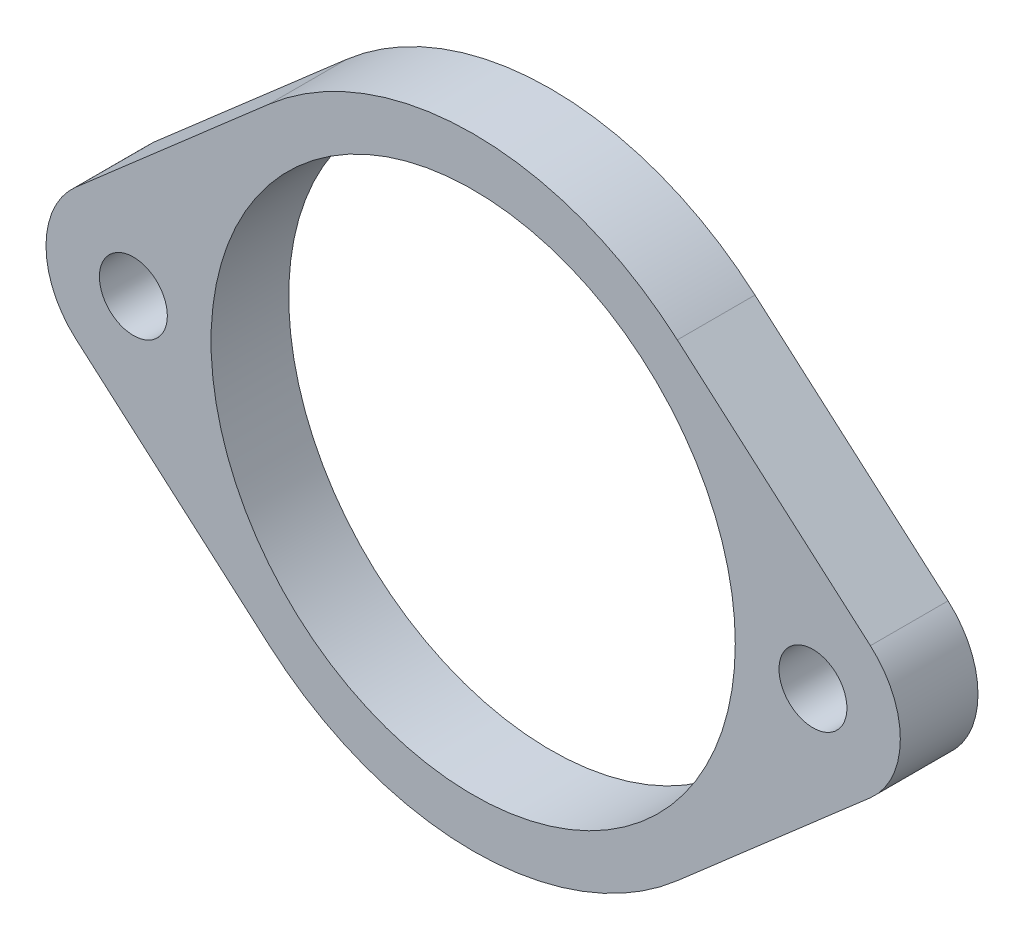
ISO-10303-21;
HEADER;
FILE_DESCRIPTION(('STEP AP214'),'2;1');
FILE_NAME('part.step','',(''),(''),'','','');
FILE_SCHEMA(('AUTOMOTIVE_DESIGN { 1 0 10303 214 1 1 1 1 }'));
ENDSEC;
DATA;
#1=APPLICATION_CONTEXT('core data for automotive mechanical design processes');
#2=APPLICATION_PROTOCOL_DEFINITION('international standard','automotive_design',2000,#1);
#3=PRODUCT_CONTEXT('',#1,'mechanical');
#4=PRODUCT('Part','Part','',(#3));
#5=PRODUCT_RELATED_PRODUCT_CATEGORY('part','',(#4));
#6=PRODUCT_DEFINITION_FORMATION('','',#4);
#7=PRODUCT_DEFINITION_CONTEXT('part definition',#1,'design');
#8=PRODUCT_DEFINITION('design','',#6,#7);
#9=PRODUCT_DEFINITION_SHAPE('','',#8);
#10=(LENGTH_UNIT() NAMED_UNIT(*) SI_UNIT(.MILLI.,.METRE.));
#11=(NAMED_UNIT(*) PLANE_ANGLE_UNIT() SI_UNIT($,.RADIAN.));
#12=(NAMED_UNIT(*) SI_UNIT($,.STERADIAN.) SOLID_ANGLE_UNIT());
#13=UNCERTAINTY_MEASURE_WITH_UNIT(LENGTH_MEASURE(1.E-05),#10,'distance_accuracy_value','');
#14=(GEOMETRIC_REPRESENTATION_CONTEXT(3) GLOBAL_UNCERTAINTY_ASSIGNED_CONTEXT((#13)) GLOBAL_UNIT_ASSIGNED_CONTEXT((#10,
#11,#12)) REPRESENTATION_CONTEXT('',''));
#15=CARTESIAN_POINT('',(0.,0.,0.));
#16=DIRECTION('',(0.,0.,1.));
#17=DIRECTION('',(1.,0.,0.));
#18=AXIS2_PLACEMENT_3D('',#15,#16,#17);
#19=CARTESIAN_POINT('',(0.,0.,6.35));
#20=DIRECTION('',(0.,0.,1.));
#21=DIRECTION('',(1.,0.,0.));
#22=AXIS2_PLACEMENT_3D('',#19,#20,#21);
#23=PLANE('',#22);
#24=CARTESIAN_POINT('',(-27.78125,0.,6.35));
#25=DIRECTION('',(0.,0.,1.));
#26=DIRECTION('',(1.,0.,0.));
#27=AXIS2_PLACEMENT_3D('',#24,#25,#26);
#28=CIRCLE('',#27,2.778125);
#29=CARTESIAN_POINT('',(-25.003125,0.,6.35));
#30=VERTEX_POINT('',#29);
#31=EDGE_CURVE('E181',#30,#30,#28,.T.);
#32=ORIENTED_EDGE('',*,*,#31,.F.);
#33=EDGE_LOOP('',(#32));
#34=FACE_BOUND('',#33,.T.);
#35=CARTESIAN_POINT('',(0.,0.,6.35));
#36=DIRECTION('',(0.,0.,1.));
#37=DIRECTION('',(1.,0.,0.));
#38=AXIS2_PLACEMENT_3D('',#35,#36,#37);
#39=CIRCLE('',#38,25.4);
#40=CARTESIAN_POINT('',(16.6914285714286,19.1456577908647,6.35));
#41=VERTEX_POINT('',#40);
#42=CARTESIAN_POINT('',(-16.6914285714286,19.1456577908647,6.35));
#43=VERTEX_POINT('',#42);
#44=EDGE_CURVE('E144',#41,#43,#39,.T.);
#45=ORIENTED_EDGE('',*,*,#44,.T.);
#46=DIRECTION('',(-0.753766054758452,-0.657142857142857,0.));
#47=VECTOR('',#46,1.);
#48=CARTESIAN_POINT('',(-16.6914285714286,19.1456577908647,6.35));
#49=LINE('',#48,#47);
#50=CARTESIAN_POINT('',(-32.4757142857143,5.38471625368069,6.35));
#51=VERTEX_POINT('',#50);
#52=EDGE_CURVE('E92',#43,#51,#49,.T.);
#53=ORIENTED_EDGE('',*,*,#52,.T.);
#54=CARTESIAN_POINT('',(-27.78125,0.,6.35));
#55=DIRECTION('',(0.,0.,1.));
#56=DIRECTION('',(1.,0.,0.));
#57=AXIS2_PLACEMENT_3D('',#54,#55,#56);
#58=CIRCLE('',#57,7.14374999999999);
#59=CARTESIAN_POINT('',(-32.4757142857143,-5.38471625368069,6.35));
#60=VERTEX_POINT('',#59);
#61=EDGE_CURVE('E159',#51,#60,#58,.T.);
#62=ORIENTED_EDGE('',*,*,#61,.T.);
#63=DIRECTION('',(0.753766054758453,-0.657142857142857,0.));
#64=VECTOR('',#63,1.);
#65=CARTESIAN_POINT('',(-32.4757142857143,-5.38471625368069,6.35));
#66=LINE('',#65,#64);
#67=CARTESIAN_POINT('',(-16.6914285714286,-19.1456577908647,6.35));
#68=VERTEX_POINT('',#67);
#69=EDGE_CURVE('E172',#60,#68,#66,.T.);
#70=ORIENTED_EDGE('',*,*,#69,.T.);
#71=CARTESIAN_POINT('',(0.,0.,6.35));
#72=DIRECTION('',(0.,0.,1.));
#73=DIRECTION('',(1.,0.,0.));
#74=AXIS2_PLACEMENT_3D('',#71,#72,#73);
#75=CIRCLE('',#74,25.4);
#76=CARTESIAN_POINT('',(16.6914285714286,-19.1456577908647,6.35));
#77=VERTEX_POINT('',#76);
#78=EDGE_CURVE('E111',#68,#77,#75,.T.);
#79=ORIENTED_EDGE('',*,*,#78,.T.);
#80=DIRECTION('',(0.753766054758453,0.657142857142857,0.));
#81=VECTOR('',#80,1.);
#82=CARTESIAN_POINT('',(16.6914285714286,-19.1456577908647,6.35));
#83=LINE('',#82,#81);
#84=CARTESIAN_POINT('',(32.4757142857143,-5.38471625368069,6.35));
#85=VERTEX_POINT('',#84);
#86=EDGE_CURVE('E105',#77,#85,#83,.T.);
#87=ORIENTED_EDGE('',*,*,#86,.T.);
#88=CARTESIAN_POINT('',(27.78125,0.,6.35));
#89=DIRECTION('',(0.,0.,1.));
#90=DIRECTION('',(1.,0.,0.));
#91=AXIS2_PLACEMENT_3D('',#88,#89,#90);
#92=CIRCLE('',#91,7.14374999999999);
#93=CARTESIAN_POINT('',(32.4757142857143,5.38471625368069,6.35));
#94=VERTEX_POINT('',#93);
#95=EDGE_CURVE('E109',#85,#94,#92,.T.);
#96=ORIENTED_EDGE('',*,*,#95,.T.);
#97=DIRECTION('',(-0.753766054758453,0.657142857142857,0.));
#98=VECTOR('',#97,1.);
#99=CARTESIAN_POINT('',(32.4757142857143,5.38471625368069,6.35));
#100=LINE('',#99,#98);
#101=EDGE_CURVE('E49',#94,#41,#100,.T.);
#102=ORIENTED_EDGE('',*,*,#101,.T.);
#103=EDGE_LOOP('',(#45,#53,#62,#70,#79,#87,#96,#102));
#104=FACE_BOUND('',#103,.T.);
#105=CARTESIAN_POINT('',(27.78125,0.,6.35));
#106=DIRECTION('',(0.,0.,1.));
#107=DIRECTION('',(1.,0.,0.));
#108=AXIS2_PLACEMENT_3D('',#105,#106,#107);
#109=CIRCLE('',#108,2.778125);
#110=CARTESIAN_POINT('',(30.559375,0.,6.35));
#111=VERTEX_POINT('',#110);
#112=EDGE_CURVE('E133',#111,#111,#109,.T.);
#113=ORIENTED_EDGE('',*,*,#112,.F.);
#114=EDGE_LOOP('',(#113));
#115=FACE_BOUND('',#114,.T.);
#116=CARTESIAN_POINT('',(0.,0.,6.35));
#117=DIRECTION('',(0.,0.,1.));
#118=DIRECTION('',(1.,0.,0.));
#119=AXIS2_PLACEMENT_3D('',#116,#117,#118);
#120=CIRCLE('',#119,21.43125);
#121=CARTESIAN_POINT('',(21.43125,0.,6.35));
#122=VERTEX_POINT('',#121);
#123=EDGE_CURVE('E187',#122,#122,#120,.T.);
#124=ORIENTED_EDGE('',*,*,#123,.F.);
#125=EDGE_LOOP('',(#124));
#126=FACE_BOUND('',#125,.T.);
#127=ADVANCED_FACE('F32',(#34,#104,#115,#126),#23,.T.);
#128=CARTESIAN_POINT('',(0.,0.,0.));
#129=DIRECTION('',(0.,0.,1.));
#130=DIRECTION('',(1.,0.,0.));
#131=AXIS2_PLACEMENT_3D('',#128,#129,#130);
#132=PLANE('',#131);
#133=CARTESIAN_POINT('',(-27.78125,0.,0.));
#134=DIRECTION('',(0.,0.,1.));
#135=DIRECTION('',(1.,0.,0.));
#136=AXIS2_PLACEMENT_3D('',#133,#134,#135);
#137=CIRCLE('',#136,2.778125);
#138=CARTESIAN_POINT('',(-25.003125,0.,0.));
#139=VERTEX_POINT('',#138);
#140=EDGE_CURVE('E184',#139,#139,#137,.T.);
#141=ORIENTED_EDGE('',*,*,#140,.T.);
#142=EDGE_LOOP('',(#141));
#143=FACE_BOUND('',#142,.T.);
#144=CARTESIAN_POINT('',(0.,0.,0.));
#145=DIRECTION('',(0.,0.,1.));
#146=DIRECTION('',(1.,0.,0.));
#147=AXIS2_PLACEMENT_3D('',#144,#145,#146);
#148=CIRCLE('',#147,25.4);
#149=CARTESIAN_POINT('',(16.6914285714286,19.1456577908647,0.));
#150=VERTEX_POINT('',#149);
#151=CARTESIAN_POINT('',(-16.6914285714286,19.1456577908647,0.));
#152=VERTEX_POINT('',#151);
#153=EDGE_CURVE('E129',#150,#152,#148,.T.);
#154=ORIENTED_EDGE('',*,*,#153,.F.);
#155=DIRECTION('',(-0.753766054758453,0.657142857142857,0.));
#156=VECTOR('',#155,1.);
#157=CARTESIAN_POINT('',(32.4757142857143,5.38471625368069,0.));
#158=LINE('',#157,#156);
#159=CARTESIAN_POINT('',(32.4757142857143,5.38471625368069,0.));
#160=VERTEX_POINT('',#159);
#161=EDGE_CURVE('E84',#160,#150,#158,.T.);
#162=ORIENTED_EDGE('',*,*,#161,.F.);
#163=CARTESIAN_POINT('',(27.78125,0.,0.));
#164=DIRECTION('',(0.,0.,1.));
#165=DIRECTION('',(1.,0.,0.));
#166=AXIS2_PLACEMENT_3D('',#163,#164,#165);
#167=CIRCLE('',#166,7.14374999999999);
#168=CARTESIAN_POINT('',(32.4757142857143,-5.38471625368069,0.));
#169=VERTEX_POINT('',#168);
#170=EDGE_CURVE('E78',#169,#160,#167,.T.);
#171=ORIENTED_EDGE('',*,*,#170,.F.);
#172=DIRECTION('',(0.753766054758453,0.657142857142857,0.));
#173=VECTOR('',#172,1.);
#174=CARTESIAN_POINT('',(16.6914285714286,-19.1456577908647,0.));
#175=LINE('',#174,#173);
#176=CARTESIAN_POINT('',(16.6914285714286,-19.1456577908647,0.));
#177=VERTEX_POINT('',#176);
#178=EDGE_CURVE('E119',#177,#169,#175,.T.);
#179=ORIENTED_EDGE('',*,*,#178,.F.);
#180=CARTESIAN_POINT('',(0.,0.,0.));
#181=DIRECTION('',(0.,0.,1.));
#182=DIRECTION('',(1.,0.,0.));
#183=AXIS2_PLACEMENT_3D('',#180,#181,#182);
#184=CIRCLE('',#183,25.4);
#185=CARTESIAN_POINT('',(-16.6914285714286,-19.1456577908647,0.));
#186=VERTEX_POINT('',#185);
#187=EDGE_CURVE('E139',#186,#177,#184,.T.);
#188=ORIENTED_EDGE('',*,*,#187,.F.);
#189=DIRECTION('',(0.753766054758453,-0.657142857142857,0.));
#190=VECTOR('',#189,1.);
#191=CARTESIAN_POINT('',(-32.4757142857143,-5.38471625368069,0.));
#192=LINE('',#191,#190);
#193=CARTESIAN_POINT('',(-32.4757142857143,-5.38471625368069,0.));
#194=VERTEX_POINT('',#193);
#195=EDGE_CURVE('E137',#194,#186,#192,.T.);
#196=ORIENTED_EDGE('',*,*,#195,.F.);
#197=CARTESIAN_POINT('',(-27.78125,0.,0.));
#198=DIRECTION('',(0.,0.,1.));
#199=DIRECTION('',(1.,0.,0.));
#200=AXIS2_PLACEMENT_3D('',#197,#198,#199);
#201=CIRCLE('',#200,7.14374999999999);
#202=CARTESIAN_POINT('',(-32.4757142857143,5.38471625368069,0.));
#203=VERTEX_POINT('',#202);
#204=EDGE_CURVE('E135',#203,#194,#201,.T.);
#205=ORIENTED_EDGE('',*,*,#204,.F.);
#206=DIRECTION('',(-0.753766054758452,-0.657142857142857,0.));
#207=VECTOR('',#206,1.);
#208=CARTESIAN_POINT('',(-16.6914285714286,19.1456577908647,0.));
#209=LINE('',#208,#207);
#210=EDGE_CURVE('E132',#152,#203,#209,.T.);
#211=ORIENTED_EDGE('',*,*,#210,.F.);
#212=EDGE_LOOP('',(#154,#162,#171,#179,#188,#196,#205,#211));
#213=FACE_BOUND('',#212,.T.);
#214=CARTESIAN_POINT('',(27.78125,0.,0.));
#215=DIRECTION('',(0.,0.,1.));
#216=DIRECTION('',(1.,0.,0.));
#217=AXIS2_PLACEMENT_3D('',#214,#215,#216);
#218=CIRCLE('',#217,2.778125);
#219=CARTESIAN_POINT('',(30.559375,0.,0.));
#220=VERTEX_POINT('',#219);
#221=EDGE_CURVE('E178',#220,#220,#218,.T.);
#222=ORIENTED_EDGE('',*,*,#221,.T.);
#223=EDGE_LOOP('',(#222));
#224=FACE_BOUND('',#223,.T.);
#225=CARTESIAN_POINT('',(0.,0.,0.));
#226=DIRECTION('',(0.,0.,1.));
#227=DIRECTION('',(1.,0.,0.));
#228=AXIS2_PLACEMENT_3D('',#225,#226,#227);
#229=CIRCLE('',#228,21.43125);
#230=CARTESIAN_POINT('',(21.43125,0.,0.));
#231=VERTEX_POINT('',#230);
#232=EDGE_CURVE('E190',#231,#231,#229,.T.);
#233=ORIENTED_EDGE('',*,*,#232,.T.);
#234=EDGE_LOOP('',(#233));
#235=FACE_BOUND('',#234,.T.);
#236=ADVANCED_FACE('F163',(#143,#213,#224,#235),#132,.F.);
#237=CARTESIAN_POINT('',(0.,0.,6.35));
#238=DIRECTION('',(0.,0.,-1.));
#239=DIRECTION('',(-1.,0.,0.));
#240=AXIS2_PLACEMENT_3D('',#237,#238,#239);
#241=CYLINDRICAL_SURFACE('',#240,25.4);
#242=ORIENTED_EDGE('',*,*,#153,.T.);
#243=DIRECTION('',(0.,0.,-1.));
#244=VECTOR('',#243,1.);
#245=CARTESIAN_POINT('',(-16.6914285714286,19.1456577908647,6.35));
#246=LINE('',#245,#244);
#247=EDGE_CURVE('E11',#43,#152,#246,.T.);
#248=ORIENTED_EDGE('',*,*,#247,.F.);
#249=ORIENTED_EDGE('',*,*,#44,.F.);
#250=DIRECTION('',(0.,0.,-1.));
#251=VECTOR('',#250,1.);
#252=CARTESIAN_POINT('',(16.6914285714286,19.1456577908647,6.35));
#253=LINE('',#252,#251);
#254=EDGE_CURVE('E125',#41,#150,#253,.T.);
#255=ORIENTED_EDGE('',*,*,#254,.T.);
#256=EDGE_LOOP('',(#242,#248,#249,#255));
#257=FACE_BOUND('',#256,.T.);
#258=ADVANCED_FACE('F34',(#257),#241,.T.);
#259=CARTESIAN_POINT('',(-16.6914285714286,19.1456577908647,6.35));
#260=DIRECTION('',(0.657142857142857,-0.753766054758452,0.));
#261=DIRECTION('',(0.753766054758452,0.657142857142857,0.));
#262=AXIS2_PLACEMENT_3D('',#259,#260,#261);
#263=PLANE('',#262);
#264=ORIENTED_EDGE('',*,*,#210,.T.);
#265=DIRECTION('',(0.,0.,-1.));
#266=VECTOR('',#265,1.);
#267=CARTESIAN_POINT('',(-32.4757142857143,5.38471625368069,6.35));
#268=LINE('',#267,#266);
#269=EDGE_CURVE('E41',#51,#203,#268,.T.);
#270=ORIENTED_EDGE('',*,*,#269,.F.);
#271=ORIENTED_EDGE('',*,*,#52,.F.);
#272=ORIENTED_EDGE('',*,*,#247,.T.);
#273=EDGE_LOOP('',(#264,#270,#271,#272));
#274=FACE_BOUND('',#273,.T.);
#275=ADVANCED_FACE('F224',(#274),#263,.F.);
#276=CARTESIAN_POINT('',(-27.78125,0.,6.35));
#277=DIRECTION('',(0.,0.,-1.));
#278=DIRECTION('',(-1.,0.,0.));
#279=AXIS2_PLACEMENT_3D('',#276,#277,#278);
#280=CYLINDRICAL_SURFACE('',#279,7.14374999999999);
#281=ORIENTED_EDGE('',*,*,#204,.T.);
#282=DIRECTION('',(0.,0.,-1.));
#283=VECTOR('',#282,1.);
#284=CARTESIAN_POINT('',(-32.4757142857143,-5.38471625368069,6.35));
#285=LINE('',#284,#283);
#286=EDGE_CURVE('E151',#60,#194,#285,.T.);
#287=ORIENTED_EDGE('',*,*,#286,.F.);
#288=ORIENTED_EDGE('',*,*,#61,.F.);
#289=ORIENTED_EDGE('',*,*,#269,.T.);
#290=EDGE_LOOP('',(#281,#287,#288,#289));
#291=FACE_BOUND('',#290,.T.);
#292=ADVANCED_FACE('F157',(#291),#280,.T.);
#293=CARTESIAN_POINT('',(-32.4757142857143,-5.38471625368069,6.35));
#294=DIRECTION('',(0.657142857142857,0.753766054758453,0.));
#295=DIRECTION('',(-0.753766054758453,0.657142857142857,0.));
#296=AXIS2_PLACEMENT_3D('',#293,#294,#295);
#297=PLANE('',#296);
#298=ORIENTED_EDGE('',*,*,#195,.T.);
#299=DIRECTION('',(0.,0.,-1.));
#300=VECTOR('',#299,1.);
#301=CARTESIAN_POINT('',(-16.6914285714286,-19.1456577908647,6.35));
#302=LINE('',#301,#300);
#303=EDGE_CURVE('E148',#68,#186,#302,.T.);
#304=ORIENTED_EDGE('',*,*,#303,.F.);
#305=ORIENTED_EDGE('',*,*,#69,.F.);
#306=ORIENTED_EDGE('',*,*,#286,.T.);
#307=EDGE_LOOP('',(#298,#304,#305,#306));
#308=FACE_BOUND('',#307,.T.);
#309=ADVANCED_FACE('F168',(#308),#297,.F.);
#310=CARTESIAN_POINT('',(0.,0.,6.35));
#311=DIRECTION('',(0.,0.,-1.));
#312=DIRECTION('',(-1.,0.,0.));
#313=AXIS2_PLACEMENT_3D('',#310,#311,#312);
#314=CYLINDRICAL_SURFACE('',#313,25.4);
#315=ORIENTED_EDGE('',*,*,#187,.T.);
#316=DIRECTION('',(0.,0.,-1.));
#317=VECTOR('',#316,1.);
#318=CARTESIAN_POINT('',(16.6914285714286,-19.1456577908647,6.35));
#319=LINE('',#318,#317);
#320=EDGE_CURVE('E120',#77,#177,#319,.T.);
#321=ORIENTED_EDGE('',*,*,#320,.F.);
#322=ORIENTED_EDGE('',*,*,#78,.F.);
#323=ORIENTED_EDGE('',*,*,#303,.T.);
#324=EDGE_LOOP('',(#315,#321,#322,#323));
#325=FACE_BOUND('',#324,.T.);
#326=ADVANCED_FACE('F171',(#325),#314,.T.);
#327=CARTESIAN_POINT('',(16.6914285714286,-19.1456577908647,6.35));
#328=DIRECTION('',(-0.657142857142857,0.753766054758452,0.));
#329=DIRECTION('',(-0.753766054758453,-0.657142857142857,0.));
#330=AXIS2_PLACEMENT_3D('',#327,#328,#329);
#331=PLANE('',#330);
#332=ORIENTED_EDGE('',*,*,#178,.T.);
#333=DIRECTION('',(0.,0.,-1.));
#334=VECTOR('',#333,1.);
#335=CARTESIAN_POINT('',(32.4757142857143,-5.38471625368069,6.35));
#336=LINE('',#335,#334);
#337=EDGE_CURVE('E116',#85,#169,#336,.T.);
#338=ORIENTED_EDGE('',*,*,#337,.F.);
#339=ORIENTED_EDGE('',*,*,#86,.F.);
#340=ORIENTED_EDGE('',*,*,#320,.T.);
#341=EDGE_LOOP('',(#332,#338,#339,#340));
#342=FACE_BOUND('',#341,.T.);
#343=ADVANCED_FACE('F117',(#342),#331,.F.);
#344=CARTESIAN_POINT('',(27.78125,0.,6.35));
#345=DIRECTION('',(0.,0.,-1.));
#346=DIRECTION('',(-1.,0.,0.));
#347=AXIS2_PLACEMENT_3D('',#344,#345,#346);
#348=CYLINDRICAL_SURFACE('',#347,7.14374999999999);
#349=ORIENTED_EDGE('',*,*,#170,.T.);
#350=DIRECTION('',(0.,0.,-1.));
#351=VECTOR('',#350,1.);
#352=CARTESIAN_POINT('',(32.4757142857143,5.38471625368069,6.35));
#353=LINE('',#352,#351);
#354=EDGE_CURVE('E121',#94,#160,#353,.T.);
#355=ORIENTED_EDGE('',*,*,#354,.F.);
#356=ORIENTED_EDGE('',*,*,#95,.F.);
#357=ORIENTED_EDGE('',*,*,#337,.T.);
#358=EDGE_LOOP('',(#349,#355,#356,#357));
#359=FACE_BOUND('',#358,.T.);
#360=ADVANCED_FACE('F123',(#359),#348,.T.);
#361=CARTESIAN_POINT('',(32.4757142857143,5.38471625368069,6.35));
#362=DIRECTION('',(-0.657142857142857,-0.753766054758452,0.));
#363=DIRECTION('',(0.753766054758453,-0.657142857142857,0.));
#364=AXIS2_PLACEMENT_3D('',#361,#362,#363);
#365=PLANE('',#364);
#366=ORIENTED_EDGE('',*,*,#161,.T.);
#367=ORIENTED_EDGE('',*,*,#254,.F.);
#368=ORIENTED_EDGE('',*,*,#101,.F.);
#369=ORIENTED_EDGE('',*,*,#354,.T.);
#370=EDGE_LOOP('',(#366,#367,#368,#369));
#371=FACE_BOUND('',#370,.T.);
#372=ADVANCED_FACE('F212',(#371),#365,.F.);
#373=CARTESIAN_POINT('',(27.78125,0.,6.35));
#374=DIRECTION('',(0.,0.,-1.));
#375=DIRECTION('',(-1.,0.,0.));
#376=AXIS2_PLACEMENT_3D('',#373,#374,#375);
#377=CYLINDRICAL_SURFACE('',#376,2.778125);
#378=ORIENTED_EDGE('',*,*,#112,.T.);
#379=EDGE_LOOP('',(#378));
#380=FACE_BOUND('',#379,.T.);
#381=ORIENTED_EDGE('',*,*,#221,.F.);
#382=EDGE_LOOP('',(#381));
#383=FACE_BOUND('',#382,.T.);
#384=ADVANCED_FACE('F209',(#380,#383),#377,.F.);
#385=CARTESIAN_POINT('',(-27.78125,0.,6.35));
#386=DIRECTION('',(0.,0.,-1.));
#387=DIRECTION('',(-1.,0.,0.));
#388=AXIS2_PLACEMENT_3D('',#385,#386,#387);
#389=CYLINDRICAL_SURFACE('',#388,2.778125);
#390=ORIENTED_EDGE('',*,*,#31,.T.);
#391=EDGE_LOOP('',(#390));
#392=FACE_BOUND('',#391,.T.);
#393=ORIENTED_EDGE('',*,*,#140,.F.);
#394=EDGE_LOOP('',(#393));
#395=FACE_BOUND('',#394,.T.);
#396=ADVANCED_FACE('F288',(#392,#395),#389,.F.);
#397=CARTESIAN_POINT('',(0.,0.,6.35));
#398=DIRECTION('',(0.,0.,-1.));
#399=DIRECTION('',(-1.,0.,0.));
#400=AXIS2_PLACEMENT_3D('',#397,#398,#399);
#401=CYLINDRICAL_SURFACE('',#400,21.43125);
#402=ORIENTED_EDGE('',*,*,#123,.T.);
#403=EDGE_LOOP('',(#402));
#404=FACE_BOUND('',#403,.T.);
#405=ORIENTED_EDGE('',*,*,#232,.F.);
#406=EDGE_LOOP('',(#405));
#407=FACE_BOUND('',#406,.T.);
#408=ADVANCED_FACE('F196',(#404,#407),#401,.F.);
#409=CLOSED_SHELL('',(#127,#236,#258,#275,#292,#309,#326,#343,#360,#372,#384,#396,#408));
#410=MANIFOLD_SOLID_BREP('B2',#409);
#411=ADVANCED_BREP_SHAPE_REPRESENTATION('',(#18,#410),#14);
#412=SHAPE_DEFINITION_REPRESENTATION(#9,#411);
ENDSEC;
END-ISO-10303-21;
